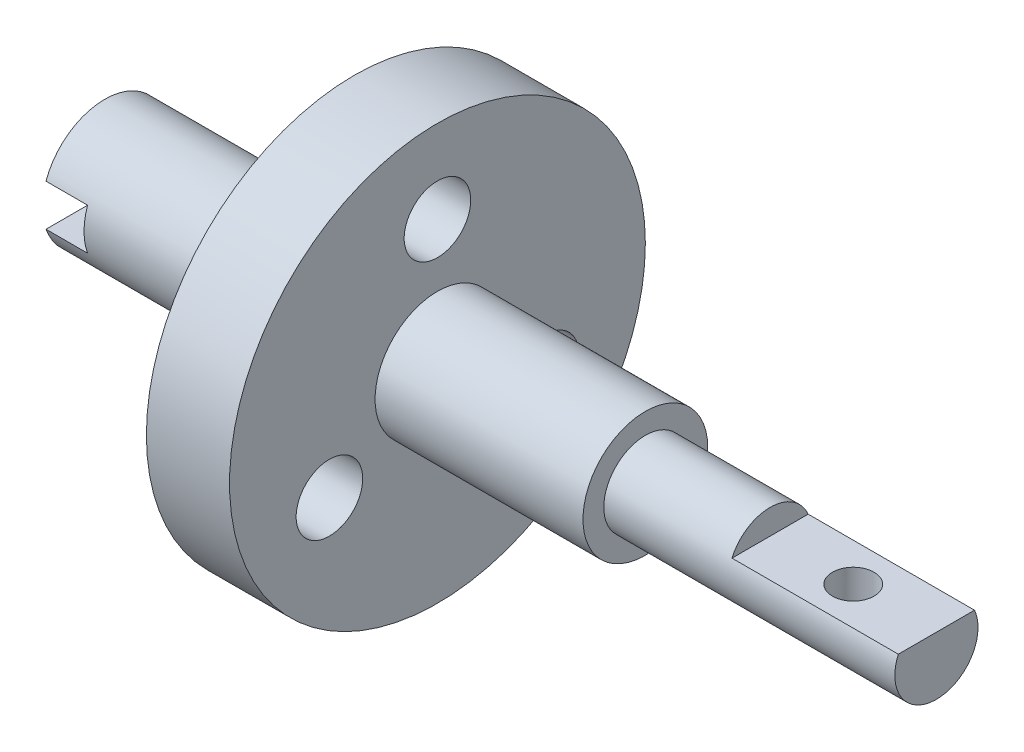
ISO-10303-21;
HEADER;
FILE_DESCRIPTION(('STEP AP214'),'2;1');
FILE_NAME('part.step','',(''),(''),'','','');
FILE_SCHEMA(('AUTOMOTIVE_DESIGN { 1 0 10303 214 1 1 1 1 }'));
ENDSEC;
DATA;
#1=APPLICATION_CONTEXT('core data for automotive mechanical design processes');
#2=APPLICATION_PROTOCOL_DEFINITION('international standard','automotive_design',2000,#1);
#3=PRODUCT_CONTEXT('',#1,'mechanical');
#4=PRODUCT('Part','Part','',(#3));
#5=PRODUCT_RELATED_PRODUCT_CATEGORY('part','',(#4));
#6=PRODUCT_DEFINITION_FORMATION('','',#4);
#7=PRODUCT_DEFINITION_CONTEXT('part definition',#1,'design');
#8=PRODUCT_DEFINITION('design','',#6,#7);
#9=PRODUCT_DEFINITION_SHAPE('','',#8);
#10=(LENGTH_UNIT() NAMED_UNIT(*) SI_UNIT(.MILLI.,.METRE.));
#11=(NAMED_UNIT(*) PLANE_ANGLE_UNIT() SI_UNIT($,.RADIAN.));
#12=(NAMED_UNIT(*) SI_UNIT($,.STERADIAN.) SOLID_ANGLE_UNIT());
#13=UNCERTAINTY_MEASURE_WITH_UNIT(LENGTH_MEASURE(1.E-05),#10,'distance_accuracy_value','');
#14=(GEOMETRIC_REPRESENTATION_CONTEXT(3) GLOBAL_UNCERTAINTY_ASSIGNED_CONTEXT((#13)) GLOBAL_UNIT_ASSIGNED_CONTEXT((#10,
#11,#12)) REPRESENTATION_CONTEXT('',''));
#15=CARTESIAN_POINT('',(0.,0.,0.));
#16=DIRECTION('',(0.,0.,1.));
#17=DIRECTION('',(1.,0.,0.));
#18=AXIS2_PLACEMENT_3D('',#15,#16,#17);
#19=CARTESIAN_POINT('',(-40.,0.,0.));
#20=DIRECTION('',(1.,0.,0.));
#21=DIRECTION('',(0.,0.,-1.));
#22=AXIS2_PLACEMENT_3D('',#19,#20,#21);
#23=PLANE('',#22);
#24=DIRECTION('',(0.,0.,1.));
#25=VECTOR('',#24,1.);
#26=CARTESIAN_POINT('',(-40.,2.5,0.));
#27=LINE('',#26,#25);
#28=CARTESIAN_POINT('',(-40.,2.5,-7.07106781186548));
#29=VERTEX_POINT('',#28);
#30=CARTESIAN_POINT('',(-40.,2.5,7.07106781186548));
#31=VERTEX_POINT('',#30);
#32=EDGE_CURVE('E390',#29,#31,#27,.T.);
#33=ORIENTED_EDGE('',*,*,#32,.T.);
#34=CARTESIAN_POINT('',(-40.,0.,0.));
#35=DIRECTION('',(-1.,0.,0.));
#36=DIRECTION('',(0.,0.,1.));
#37=AXIS2_PLACEMENT_3D('',#34,#35,#36);
#38=CIRCLE('',#37,7.5);
#39=EDGE_CURVE('E119',#31,#29,#38,.T.);
#40=ORIENTED_EDGE('',*,*,#39,.T.);
#41=EDGE_LOOP('',(#33,#40));
#42=FACE_BOUND('',#41,.T.);
#43=ADVANCED_FACE('F41',(#42),#23,.F.);
#44=CARTESIAN_POINT('',(0.,0.,0.));
#45=DIRECTION('',(1.,0.,0.));
#46=DIRECTION('',(0.,0.,-1.));
#47=AXIS2_PLACEMENT_3D('',#44,#45,#46);
#48=CYLINDRICAL_SURFACE('',#47,7.5);
#49=CARTESIAN_POINT('',(0.,0.,0.));
#50=DIRECTION('',(1.,0.,0.));
#51=DIRECTION('',(0.,0.,-1.));
#52=AXIS2_PLACEMENT_3D('',#49,#50,#51);
#53=CIRCLE('',#52,7.5);
#54=CARTESIAN_POINT('',(0.,0.,-7.5));
#55=VERTEX_POINT('',#54);
#56=EDGE_CURVE('E50',#55,#55,#53,.T.);
#57=ORIENTED_EDGE('',*,*,#56,.T.);
#58=EDGE_LOOP('',(#57));
#59=FACE_BOUND('',#58,.T.);
#60=CARTESIAN_POINT('',(25.,0.,0.));
#61=DIRECTION('',(1.,0.,0.));
#62=DIRECTION('',(0.,0.,-1.));
#63=AXIS2_PLACEMENT_3D('',#60,#61,#62);
#64=CIRCLE('',#63,7.5);
#65=CARTESIAN_POINT('',(25.,0.,-7.5));
#66=VERTEX_POINT('',#65);
#67=EDGE_CURVE('E199',#66,#66,#64,.F.);
#68=ORIENTED_EDGE('',*,*,#67,.T.);
#69=EDGE_LOOP('',(#68));
#70=FACE_BOUND('',#69,.T.);
#71=ADVANCED_FACE('F177',(#59,#70),#48,.T.);
#72=CARTESIAN_POINT('',(-40.,0.,0.));
#73=DIRECTION('',(1.,0.,0.));
#74=DIRECTION('',(0.,0.,-1.));
#75=AXIS2_PLACEMENT_3D('',#72,#73,#74);
#76=CYLINDRICAL_SURFACE('',#75,25.);
#77=CARTESIAN_POINT('',(0.,0.,0.));
#78=DIRECTION('',(1.,0.,0.));
#79=DIRECTION('',(0.,0.,-1.));
#80=AXIS2_PLACEMENT_3D('',#77,#78,#79);
#81=CIRCLE('',#80,25.);
#82=CARTESIAN_POINT('',(0.,0.,-25.));
#83=VERTEX_POINT('',#82);
#84=EDGE_CURVE('E12',#83,#83,#81,.F.);
#85=ORIENTED_EDGE('',*,*,#84,.T.);
#86=EDGE_LOOP('',(#85));
#87=FACE_BOUND('',#86,.T.);
#88=CARTESIAN_POINT('',(-10.,0.,0.));
#89=DIRECTION('',(-1.,0.,0.));
#90=DIRECTION('',(0.,0.,1.));
#91=AXIS2_PLACEMENT_3D('',#88,#89,#90);
#92=CIRCLE('',#91,25.);
#93=CARTESIAN_POINT('',(-10.,0.,25.));
#94=VERTEX_POINT('',#93);
#95=EDGE_CURVE('E209',#94,#94,#92,.F.);
#96=ORIENTED_EDGE('',*,*,#95,.T.);
#97=EDGE_LOOP('',(#96));
#98=FACE_BOUND('',#97,.T.);
#99=ADVANCED_FACE('F43',(#87,#98),#76,.T.);
#100=CARTESIAN_POINT('',(0.,0.,0.));
#101=DIRECTION('',(1.,0.,0.));
#102=DIRECTION('',(0.,0.,-1.));
#103=AXIS2_PLACEMENT_3D('',#100,#101,#102);
#104=PLANE('',#103);
#105=CARTESIAN_POINT('',(0.,15.,0.));
#106=DIRECTION('',(1.,0.,0.));
#107=DIRECTION('',(0.,0.,-1.));
#108=AXIS2_PLACEMENT_3D('',#105,#106,#107);
#109=CIRCLE('',#108,4.);
#110=CARTESIAN_POINT('',(0.,15.,-4.));
#111=VERTEX_POINT('',#110);
#112=EDGE_CURVE('E126',#111,#111,#109,.T.);
#113=ORIENTED_EDGE('',*,*,#112,.F.);
#114=EDGE_LOOP('',(#113));
#115=FACE_BOUND('',#114,.T.);
#116=CARTESIAN_POINT('',(0.,-7.50000000000006,-12.9903810567665));
#117=DIRECTION('',(1.,0.,0.));
#118=DIRECTION('',(0.,0.,-1.));
#119=AXIS2_PLACEMENT_3D('',#116,#117,#118);
#120=CIRCLE('',#119,4.);
#121=CARTESIAN_POINT('',(0.,-7.50000000000006,-16.9903810567665));
#122=VERTEX_POINT('',#121);
#123=EDGE_CURVE('E130',#122,#122,#120,.T.);
#124=ORIENTED_EDGE('',*,*,#123,.F.);
#125=EDGE_LOOP('',(#124));
#126=FACE_BOUND('',#125,.T.);
#127=CARTESIAN_POINT('',(0.,-7.49999999999988,12.9903810567667));
#128=DIRECTION('',(1.,0.,0.));
#129=DIRECTION('',(0.,0.,-1.));
#130=AXIS2_PLACEMENT_3D('',#127,#128,#129);
#131=CIRCLE('',#130,4.);
#132=CARTESIAN_POINT('',(0.,-7.49999999999988,8.99038105676665));
#133=VERTEX_POINT('',#132);
#134=EDGE_CURVE('E133',#133,#133,#131,.T.);
#135=ORIENTED_EDGE('',*,*,#134,.F.);
#136=EDGE_LOOP('',(#135));
#137=FACE_BOUND('',#136,.T.);
#138=ORIENTED_EDGE('',*,*,#84,.F.);
#139=EDGE_LOOP('',(#138));
#140=FACE_BOUND('',#139,.T.);
#141=ORIENTED_EDGE('',*,*,#56,.F.);
#142=EDGE_LOOP('',(#141));
#143=FACE_BOUND('',#142,.T.);
#144=ADVANCED_FACE('F226',(#115,#126,#137,#140,#143),#104,.T.);
#145=CARTESIAN_POINT('',(-10.,0.,0.));
#146=DIRECTION('',(-1.,0.,0.));
#147=DIRECTION('',(0.,0.,1.));
#148=AXIS2_PLACEMENT_3D('',#145,#146,#147);
#149=PLANE('',#148);
#150=CARTESIAN_POINT('',(-10.,15.,0.));
#151=DIRECTION('',(-1.,0.,0.));
#152=DIRECTION('',(0.,0.,1.));
#153=AXIS2_PLACEMENT_3D('',#150,#151,#152);
#154=CIRCLE('',#153,4.);
#155=CARTESIAN_POINT('',(-10.,15.,4.));
#156=VERTEX_POINT('',#155);
#157=EDGE_CURVE('E45',#156,#156,#154,.T.);
#158=ORIENTED_EDGE('',*,*,#157,.F.);
#159=EDGE_LOOP('',(#158));
#160=FACE_BOUND('',#159,.T.);
#161=CARTESIAN_POINT('',(-10.,-7.50000000000006,-12.9903810567665));
#162=DIRECTION('',(-1.,0.,0.));
#163=DIRECTION('',(0.,0.,1.));
#164=AXIS2_PLACEMENT_3D('',#161,#162,#163);
#165=CIRCLE('',#164,4.);
#166=CARTESIAN_POINT('',(-10.,-7.50000000000006,-8.99038105676655));
#167=VERTEX_POINT('',#166);
#168=EDGE_CURVE('E214',#167,#167,#165,.T.);
#169=ORIENTED_EDGE('',*,*,#168,.F.);
#170=EDGE_LOOP('',(#169));
#171=FACE_BOUND('',#170,.T.);
#172=CARTESIAN_POINT('',(-10.,-7.49999999999988,12.9903810567667));
#173=DIRECTION('',(-1.,0.,0.));
#174=DIRECTION('',(0.,0.,1.));
#175=AXIS2_PLACEMENT_3D('',#172,#173,#174);
#176=CIRCLE('',#175,4.);
#177=CARTESIAN_POINT('',(-10.,-7.49999999999988,16.9903810567667));
#178=VERTEX_POINT('',#177);
#179=EDGE_CURVE('E129',#178,#178,#176,.T.);
#180=ORIENTED_EDGE('',*,*,#179,.F.);
#181=EDGE_LOOP('',(#180));
#182=FACE_BOUND('',#181,.T.);
#183=ORIENTED_EDGE('',*,*,#95,.F.);
#184=EDGE_LOOP('',(#183));
#185=FACE_BOUND('',#184,.T.);
#186=CARTESIAN_POINT('',(-10.,0.,0.));
#187=DIRECTION('',(-1.,0.,0.));
#188=DIRECTION('',(0.,0.,1.));
#189=AXIS2_PLACEMENT_3D('',#186,#187,#188);
#190=CIRCLE('',#189,7.5);
#191=CARTESIAN_POINT('',(-10.,0.,7.5));
#192=VERTEX_POINT('',#191);
#193=EDGE_CURVE('E201',#192,#192,#190,.T.);
#194=ORIENTED_EDGE('',*,*,#193,.F.);
#195=EDGE_LOOP('',(#194));
#196=FACE_BOUND('',#195,.T.);
#197=ADVANCED_FACE('F193',(#160,#171,#182,#185,#196),#149,.T.);
#198=CARTESIAN_POINT('',(-10.,0.,0.));
#199=DIRECTION('',(-1.,0.,0.));
#200=DIRECTION('',(0.,0.,1.));
#201=AXIS2_PLACEMENT_3D('',#198,#199,#200);
#202=CYLINDRICAL_SURFACE('',#201,7.5);
#203=DIRECTION('',(-1.,0.,0.));
#204=VECTOR('',#203,1.);
#205=CARTESIAN_POINT('',(-35.,-2.5,-7.07106781186548));
#206=LINE('',#205,#204);
#207=CARTESIAN_POINT('',(-35.,-2.5,-7.07106781186548));
#208=VERTEX_POINT('',#207);
#209=CARTESIAN_POINT('',(-40.,-2.5,-7.07106781186548));
#210=VERTEX_POINT('',#209);
#211=EDGE_CURVE('E121',#208,#210,#206,.T.);
#212=ORIENTED_EDGE('',*,*,#211,.F.);
#213=CARTESIAN_POINT('',(-35.,0.,0.));
#214=DIRECTION('',(-1.,0.,0.));
#215=DIRECTION('',(0.,0.,1.));
#216=AXIS2_PLACEMENT_3D('',#213,#214,#215);
#217=CIRCLE('',#216,7.5);
#218=CARTESIAN_POINT('',(-35.,2.5,-7.07106781186548));
#219=VERTEX_POINT('',#218);
#220=EDGE_CURVE('E102',#219,#208,#217,.T.);
#221=ORIENTED_EDGE('',*,*,#220,.F.);
#222=DIRECTION('',(-1.,0.,0.));
#223=VECTOR('',#222,1.);
#224=CARTESIAN_POINT('',(-35.,2.5,-7.07106781186548));
#225=LINE('',#224,#223);
#226=EDGE_CURVE('E99',#219,#29,#225,.T.);
#227=ORIENTED_EDGE('',*,*,#226,.T.);
#228=ORIENTED_EDGE('',*,*,#39,.F.);
#229=DIRECTION('',(-1.,0.,0.));
#230=VECTOR('',#229,1.);
#231=CARTESIAN_POINT('',(-35.,2.5,7.07106781186548));
#232=LINE('',#231,#230);
#233=CARTESIAN_POINT('',(-35.,2.5,7.07106781186548));
#234=VERTEX_POINT('',#233);
#235=EDGE_CURVE('E58',#234,#31,#232,.T.);
#236=ORIENTED_EDGE('',*,*,#235,.F.);
#237=CARTESIAN_POINT('',(-35.,-2.5,7.07106781186548));
#238=VERTEX_POINT('',#237);
#239=EDGE_CURVE('E103',#238,#234,#217,.T.);
#240=ORIENTED_EDGE('',*,*,#239,.F.);
#241=DIRECTION('',(-1.,0.,0.));
#242=VECTOR('',#241,1.);
#243=CARTESIAN_POINT('',(-35.,-2.5,7.07106781186548));
#244=LINE('',#243,#242);
#245=CARTESIAN_POINT('',(-40.,-2.5,7.07106781186548));
#246=VERTEX_POINT('',#245);
#247=EDGE_CURVE('E136',#238,#246,#244,.T.);
#248=ORIENTED_EDGE('',*,*,#247,.T.);
#249=EDGE_CURVE('E198',#210,#246,#38,.T.);
#250=ORIENTED_EDGE('',*,*,#249,.F.);
#251=EDGE_LOOP('',(#212,#221,#227,#228,#236,#240,#248,#250));
#252=FACE_BOUND('',#251,.T.);
#253=ORIENTED_EDGE('',*,*,#193,.T.);
#254=EDGE_LOOP('',(#253));
#255=FACE_BOUND('',#254,.T.);
#256=ADVANCED_FACE('F116',(#252,#255),#202,.T.);
#257=ORIENTED_EDGE('',*,*,#249,.T.);
#258=DIRECTION('',(0.,0.,1.));
#259=VECTOR('',#258,1.);
#260=CARTESIAN_POINT('',(-40.,-2.5,0.));
#261=LINE('',#260,#259);
#262=EDGE_CURVE('E112',#210,#246,#261,.T.);
#263=ORIENTED_EDGE('',*,*,#262,.F.);
#264=EDGE_LOOP('',(#257,#263));
#265=FACE_BOUND('',#264,.T.);
#266=ADVANCED_FACE('F179',(#265),#23,.F.);
#267=CARTESIAN_POINT('',(25.,0.,0.));
#268=DIRECTION('',(1.,0.,0.));
#269=DIRECTION('',(0.,0.,-1.));
#270=AXIS2_PLACEMENT_3D('',#267,#268,#269);
#271=PLANE('',#270);
#272=ORIENTED_EDGE('',*,*,#67,.F.);
#273=EDGE_LOOP('',(#272));
#274=FACE_BOUND('',#273,.T.);
#275=CARTESIAN_POINT('',(25.,0.,0.));
#276=DIRECTION('',(1.,0.,0.));
#277=DIRECTION('',(0.,0.,-1.));
#278=AXIS2_PLACEMENT_3D('',#275,#276,#277);
#279=CIRCLE('',#278,5.);
#280=CARTESIAN_POINT('',(25.,0.,-5.));
#281=VERTEX_POINT('',#280);
#282=EDGE_CURVE('E203',#281,#281,#279,.T.);
#283=ORIENTED_EDGE('',*,*,#282,.F.);
#284=EDGE_LOOP('',(#283));
#285=FACE_BOUND('',#284,.T.);
#286=ADVANCED_FACE('F186',(#274,#285),#271,.T.);
#287=CARTESIAN_POINT('',(25.,0.,0.));
#288=DIRECTION('',(1.,0.,0.));
#289=DIRECTION('',(0.,0.,-1.));
#290=AXIS2_PLACEMENT_3D('',#287,#288,#289);
#291=CYLINDRICAL_SURFACE('',#290,5.);
#292=CARTESIAN_POINT('',(50.,-4.33012701892219,2.5));
#293=CARTESIAN_POINT('',(49.8697334931235,-4.33013982272991,2.49998948436432));
#294=CARTESIAN_POINT('',(49.7392972793237,-4.33609541965583,2.48974954513168));
#295=CARTESIAN_POINT('',(49.4824310284708,-4.35905877051907,2.44930840724944));
#296=CARTESIAN_POINT('',(49.3560099959427,-4.37608974726023,2.41906526369545));
#297=CARTESIAN_POINT('',(49.1113710544389,-4.41873376871659,2.3402497699757));
#298=CARTESIAN_POINT('',(48.9931134264378,-4.44430111338921,2.29177485369963));
#299=CARTESIAN_POINT('',(48.7664394369055,-4.50106659111455,2.17816884056414));
#300=CARTESIAN_POINT('',(48.6580236082042,-4.53226502875883,2.11303684262671));
#301=CARTESIAN_POINT('',(48.4442356960831,-4.59992173524851,1.96166634317253));
#302=CARTESIAN_POINT('',(48.3398521655102,-4.63660159331577,1.87413008816917));
#303=CARTESIAN_POINT('',(48.1464790242868,-4.70929956727453,1.68313452122752));
#304=CARTESIAN_POINT('',(48.057497092245,-4.74531734512768,1.57966731506051));
#305=CARTESIAN_POINT('',(47.8915821235144,-4.81553692452135,1.35122390789081));
#306=CARTESIAN_POINT('',(47.8158655807208,-4.84945266064072,1.22526797235894));
#307=CARTESIAN_POINT('',(47.6871478665161,-4.90876890230193,0.960392566671143));
#308=CARTESIAN_POINT('',(47.6341323595615,-4.93417477954535,0.82148134538998));
#309=CARTESIAN_POINT('',(47.556238346836,-4.9720115311507,0.545112359773521));
#310=CARTESIAN_POINT('',(47.5296261841349,-4.98523700553425,0.408254476210981));
#311=CARTESIAN_POINT('',(47.4995847032887,-5.00018959613973,0.131426571755675));
#312=CARTESIAN_POINT('',(47.4961413580046,-5.00192366961168,-0.00854151460651022));
#313=CARTESIAN_POINT('',(47.5118666849314,-4.99407454791405,-0.274581311061966));
#314=CARTESIAN_POINT('',(47.5290950388045,-4.98546239730476,-0.400802997942675));
#315=CARTESIAN_POINT('',(47.5822021097601,-4.95935613149294,-0.648284429795112));
#316=CARTESIAN_POINT('',(47.6180822224402,-4.94186135165964,-0.769543802734627));
#317=CARTESIAN_POINT('',(47.7077064152249,-4.89928958219156,-1.00577347892408));
#318=CARTESIAN_POINT('',(47.7616907829303,-4.87411103823003,-1.120633558788));
#319=CARTESIAN_POINT('',(47.8856585405036,-4.81844114966712,-1.33994200378327));
#320=CARTESIAN_POINT('',(47.9556476582558,-4.78794790393709,-1.4443866220966));
#321=CARTESIAN_POINT('',(48.1172383788326,-4.72110985998075,-1.6504341522455));
#322=CARTESIAN_POINT('',(48.210257570815,-4.68448439995438,-1.7508351875734));
#323=CARTESIAN_POINT('',(48.4114743123254,-4.61135851467029,-1.93526092574444));
#324=CARTESIAN_POINT('',(48.5196834306851,-4.57485820664072,-2.01927302893558));
#325=CARTESIAN_POINT('',(48.7566204810602,-4.50360390231212,-2.17376333660553));
#326=CARTESIAN_POINT('',(48.8862150576355,-4.46910799976769,-2.24304328744513));
#327=CARTESIAN_POINT('',(49.1573441783975,-4.4093862569644,-2.35829778250308));
#328=CARTESIAN_POINT('',(49.2988660825439,-4.38415075115168,-2.40429664552722));
#329=CARTESIAN_POINT('',(49.578036278207,-4.34861589542586,-2.4679505275626));
#330=CARTESIAN_POINT('',(49.7151027976089,-4.33729139621241,-2.48756280529994));
#331=CARTESIAN_POINT('',(49.9910033537913,-4.32794798404024,-2.50379236652857));
#332=CARTESIAN_POINT('',(50.1298360727995,-4.32991967223279,-2.50042589328757));
#333=CARTESIAN_POINT('',(50.3891347964468,-4.34585841351462,-2.47259010835991));
#334=CARTESIAN_POINT('',(50.5099486277697,-4.35848968766635,-2.45046954178116));
#335=CARTESIAN_POINT('',(50.7459194656775,-4.39235053878353,-2.38924071158112));
#336=CARTESIAN_POINT('',(50.8610746268668,-4.41358290012585,-2.35012694655908));
#337=CARTESIAN_POINT('',(51.0885283272564,-4.46340555199141,-2.25411897151217));
#338=CARTESIAN_POINT('',(51.2004475421326,-4.49229108107657,-2.19648515923163));
#339=CARTESIAN_POINT('',(51.4136731788488,-4.55390298743125,-2.0657176600397));
#340=CARTESIAN_POINT('',(51.5149741087881,-4.58663133387872,-1.99257601083123));
#341=CARTESIAN_POINT('',(51.7174469188033,-4.65719996140836,-1.82209291799635));
#342=CARTESIAN_POINT('',(51.8169928767722,-4.69516457885708,-1.72286318078434));
#343=CARTESIAN_POINT('',(51.9985305950059,-4.76835587444746,-1.50851123849879));
#344=CARTESIAN_POINT('',(52.0805164256586,-4.80358162519329,-1.39338368664988));
#345=CARTESIAN_POINT('',(52.2264343147909,-4.86853404227334,-1.14633840638507));
#346=CARTESIAN_POINT('',(52.2898327952085,-4.89809104179855,-1.01405774389062));
#347=CARTESIAN_POINT('',(52.392844759962,-4.9470838739847,-0.738805911647331));
#348=CARTESIAN_POINT('',(52.4324791296051,-4.96652859191746,-0.595844253647065));
#349=CARTESIAN_POINT('',(52.4834214093564,-4.99168770453968,-0.317449205674703));
#350=CARTESIAN_POINT('',(52.4969946858303,-4.99849819767838,-0.182528609085373));
#351=CARTESIAN_POINT('',(52.5021081674946,-5.00105325940467,0.0878149643374356));
#352=CARTESIAN_POINT('',(52.4936560856611,-4.99680170177041,0.223237748727021));
#353=CARTESIAN_POINT('',(52.4564589696045,-4.97834922085637,0.481344982671078));
#354=CARTESIAN_POINT('',(52.4290878283637,-4.96482236636807,0.604280801321777));
#355=CARTESIAN_POINT('',(52.3566825502417,-4.92980234191731,0.843614873664458));
#356=CARTESIAN_POINT('',(52.3116458803664,-4.90830802955518,0.960012187087216));
#357=CARTESIAN_POINT('',(52.2031821812607,-4.85814826741488,1.18855854199593));
#358=CARTESIAN_POINT('',(52.1390509753102,-4.82921542506803,1.30031295715363));
#359=CARTESIAN_POINT('',(51.9951058898524,-4.76720333344986,1.51193650408535));
#360=CARTESIAN_POINT('',(51.9152848073731,-4.73412218229104,1.61180014305398));
#361=CARTESIAN_POINT('',(51.7330042055506,-4.66321523550925,1.8072854232437));
#362=CARTESIAN_POINT('',(51.6290822739993,-4.62524489658366,1.90149582349002));
#363=CARTESIAN_POINT('',(51.4063847146178,-4.55157698284941,2.07165660492503));
#364=CARTESIAN_POINT('',(51.2875960858008,-4.51588143910584,2.1475908315154));
#365=CARTESIAN_POINT('',(51.0333638823357,-4.44998982823926,2.28108393396029));
#366=CARTESIAN_POINT('',(50.8975126115754,-4.42000320346984,2.3379862797745));
#367=CARTESIAN_POINT('',(50.6867773504802,-4.38370272660093,2.40494911880459));
#368=CARTESIAN_POINT('',(50.6154402243024,-4.37305486646054,2.42419582683991));
#369=CARTESIAN_POINT('',(50.4709593031507,-4.35507574170935,2.45635087255789));
#370=CARTESIAN_POINT('',(50.3978168090456,-4.34774215854234,2.46926364179177));
#371=CARTESIAN_POINT('',(50.2704990134531,-4.3382377954292,2.48591166201424));
#372=CARTESIAN_POINT('',(50.2165836784878,-4.33520487024791,2.49118864979203));
#373=CARTESIAN_POINT('',(50.1084553836896,-4.33114674911322,2.49823512543934));
#374=CARTESIAN_POINT('',(50.0542424041894,-4.33012168747261,2.50000437866475));
#375=CARTESIAN_POINT('',(50.,-4.33012701892219,2.5));
#376=B_SPLINE_CURVE_WITH_KNOTS('',3,(#292,#293,#294,#295,#296,#297,#298,#299,#300,#301,#302,
#303,#304,#305,#306,#307,#308,#309,#310,#311,#312,#313,#314,#315,#316,#317,#318,#319,#320,#321,
#322,#323,#324,#325,#326,#327,#328,#329,#330,#331,#332,#333,#334,#335,#336,#337,#338,#339,#340,
#341,#342,#343,#344,#345,#346,#347,#348,#349,#350,#351,#352,#353,#354,#355,#356,#357,#358,#359,
#360,#361,#362,#363,#364,#365,#366,#367,#368,#369,#370,#371,#372,#373,#374,#375),.UNSPECIFIED.,
.T.,.F.,(4,2,2,2,2,2,2,2,2,2,2,2,2,2,2,2,2,2,2,2,2,2,2,2,2,2,2,2,2,2,2,2,2,2,2,2,2,2,2,2,2,4),
(0.,0.390580306486788,0.781982232062015,1.17132148982692,1.56068181366371,1.98215578129642,
2.40383927716012,2.85394730601993,3.30377067414811,3.72158712424922,4.13915059220184,
4.5204024371643,4.90168281298722,5.28823836832951,5.67493248380764,6.09817978647309,
6.5217512061988,6.97222104328704,7.42221935534346,7.83655727140613,8.25060232976016,
8.61935458565147,8.98822631095241,9.37418241020303,9.76033715555202,10.1951685895662,
10.6301466245059,11.076604535375,11.5226694952701,11.927806759788,12.3328021699001,
12.7111106218382,13.0894733378512,13.4840187680376,13.8787457525688,14.3127560463025,
14.7471485711797,15.195268726016,15.4189244153949,15.6424233996907,15.8050484542806,
15.9676843870379),.UNSPECIFIED.);
#377=CARTESIAN_POINT('',(50.,-4.33012701892219,2.5));
#378=VERTEX_POINT('',#377);
#379=EDGE_CURVE('E140',#378,#378,#376,.T.);
#380=ORIENTED_EDGE('',*,*,#379,.F.);
#381=EDGE_LOOP('',(#380));
#382=FACE_BOUND('',#381,.T.);
#383=DIRECTION('',(1.,0.,0.));
#384=VECTOR('',#383,1.);
#385=CARTESIAN_POINT('',(40.,2.,-4.58257569495584));
#386=LINE('',#385,#384);
#387=CARTESIAN_POINT('',(40.,2.,-4.58257569495584));
#388=VERTEX_POINT('',#387);
#389=CARTESIAN_POINT('',(60.,2.,-4.58257569495584));
#390=VERTEX_POINT('',#389);
#391=EDGE_CURVE('E256',#388,#390,#386,.T.);
#392=ORIENTED_EDGE('',*,*,#391,.T.);
#393=CARTESIAN_POINT('',(60.,0.,0.));
#394=DIRECTION('',(1.,0.,0.));
#395=DIRECTION('',(0.,0.,-1.));
#396=AXIS2_PLACEMENT_3D('',#393,#394,#395);
#397=CIRCLE('',#396,5.);
#398=CARTESIAN_POINT('',(60.,2.,4.58257569495584));
#399=VERTEX_POINT('',#398);
#400=EDGE_CURVE('E253',#399,#390,#397,.T.);
#401=ORIENTED_EDGE('',*,*,#400,.F.);
#402=DIRECTION('',(1.,0.,0.));
#403=VECTOR('',#402,1.);
#404=CARTESIAN_POINT('',(40.,2.,4.58257569495584));
#405=LINE('',#404,#403);
#406=CARTESIAN_POINT('',(40.,2.,4.58257569495584));
#407=VERTEX_POINT('',#406);
#408=EDGE_CURVE('E66',#407,#399,#405,.T.);
#409=ORIENTED_EDGE('',*,*,#408,.F.);
#410=CARTESIAN_POINT('',(40.,0.,0.));
#411=DIRECTION('',(1.,0.,0.));
#412=DIRECTION('',(0.,0.,-1.));
#413=AXIS2_PLACEMENT_3D('',#410,#411,#412);
#414=CIRCLE('',#413,5.);
#415=EDGE_CURVE('E149',#388,#407,#414,.T.);
#416=ORIENTED_EDGE('',*,*,#415,.F.);
#417=EDGE_LOOP('',(#392,#401,#409,#416));
#418=FACE_BOUND('',#417,.T.);
#419=ORIENTED_EDGE('',*,*,#282,.T.);
#420=EDGE_LOOP('',(#419));
#421=FACE_BOUND('',#420,.T.);
#422=ADVANCED_FACE('F151',(#382,#418,#421),#291,.T.);
#423=CARTESIAN_POINT('',(60.,0.,0.));
#424=DIRECTION('',(1.,0.,0.));
#425=DIRECTION('',(0.,0.,-1.));
#426=AXIS2_PLACEMENT_3D('',#423,#424,#425);
#427=PLANE('',#426);
#428=DIRECTION('',(0.,0.,-1.));
#429=VECTOR('',#428,1.);
#430=CARTESIAN_POINT('',(60.,2.,0.));
#431=LINE('',#430,#429);
#432=EDGE_CURVE('E148',#399,#390,#431,.T.);
#433=ORIENTED_EDGE('',*,*,#432,.F.);
#434=ORIENTED_EDGE('',*,*,#400,.T.);
#435=EDGE_LOOP('',(#433,#434));
#436=FACE_BOUND('',#435,.T.);
#437=ADVANCED_FACE('F168',(#436),#427,.T.);
#438=CARTESIAN_POINT('',(40.,2.,0.));
#439=DIRECTION('',(0.,-1.,0.));
#440=DIRECTION('',(0.,0.,-1.));
#441=AXIS2_PLACEMENT_3D('',#438,#439,#440);
#442=PLANE('',#441);
#443=CARTESIAN_POINT('',(50.,2.,0.));
#444=DIRECTION('',(0.,1.,0.));
#445=DIRECTION('',(0.,0.,1.));
#446=AXIS2_PLACEMENT_3D('',#443,#444,#445);
#447=CIRCLE('',#446,2.5);
#448=CARTESIAN_POINT('',(50.,2.,2.5));
#449=VERTEX_POINT('',#448);
#450=EDGE_CURVE('E137',#449,#449,#447,.T.);
#451=ORIENTED_EDGE('',*,*,#450,.F.);
#452=EDGE_LOOP('',(#451));
#453=FACE_BOUND('',#452,.T.);
#454=ORIENTED_EDGE('',*,*,#432,.T.);
#455=ORIENTED_EDGE('',*,*,#391,.F.);
#456=DIRECTION('',(0.,0.,-1.));
#457=VECTOR('',#456,1.);
#458=CARTESIAN_POINT('',(40.,2.,0.));
#459=LINE('',#458,#457);
#460=EDGE_CURVE('E259',#407,#388,#459,.T.);
#461=ORIENTED_EDGE('',*,*,#460,.F.);
#462=ORIENTED_EDGE('',*,*,#408,.T.);
#463=EDGE_LOOP('',(#454,#455,#461,#462));
#464=FACE_BOUND('',#463,.T.);
#465=ADVANCED_FACE('F165',(#453,#464),#442,.F.);
#466=CARTESIAN_POINT('',(40.,0.,0.));
#467=DIRECTION('',(1.,0.,0.));
#468=DIRECTION('',(0.,0.,-1.));
#469=AXIS2_PLACEMENT_3D('',#466,#467,#468);
#470=PLANE('',#469);
#471=ORIENTED_EDGE('',*,*,#415,.T.);
#472=ORIENTED_EDGE('',*,*,#460,.T.);
#473=EDGE_LOOP('',(#471,#472));
#474=FACE_BOUND('',#473,.T.);
#475=ADVANCED_FACE('F161',(#474),#470,.T.);
#476=CARTESIAN_POINT('',(50.,-25.,0.));
#477=DIRECTION('',(0.,1.,0.));
#478=DIRECTION('',(0.,0.,1.));
#479=AXIS2_PLACEMENT_3D('',#476,#477,#478);
#480=CYLINDRICAL_SURFACE('',#479,2.5);
#481=ORIENTED_EDGE('',*,*,#379,.T.);
#482=EDGE_LOOP('',(#481));
#483=FACE_BOUND('',#482,.T.);
#484=ORIENTED_EDGE('',*,*,#450,.T.);
#485=EDGE_LOOP('',(#484));
#486=FACE_BOUND('',#485,.T.);
#487=ADVANCED_FACE('F155',(#483,#486),#480,.F.);
#488=CARTESIAN_POINT('',(-20.,-7.49999999999988,12.9903810567667));
#489=DIRECTION('',(1.,0.,0.));
#490=DIRECTION('',(0.,0.,-1.));
#491=AXIS2_PLACEMENT_3D('',#488,#489,#490);
#492=CYLINDRICAL_SURFACE('',#491,4.);
#493=ORIENTED_EDGE('',*,*,#179,.T.);
#494=EDGE_LOOP('',(#493));
#495=FACE_BOUND('',#494,.T.);
#496=ORIENTED_EDGE('',*,*,#134,.T.);
#497=EDGE_LOOP('',(#496));
#498=FACE_BOUND('',#497,.T.);
#499=ADVANCED_FACE('F160',(#495,#498),#492,.F.);
#500=CARTESIAN_POINT('',(-20.,-7.50000000000006,-12.9903810567665));
#501=DIRECTION('',(1.,0.,0.));
#502=DIRECTION('',(0.,0.,-1.));
#503=AXIS2_PLACEMENT_3D('',#500,#501,#502);
#504=CYLINDRICAL_SURFACE('',#503,4.);
#505=ORIENTED_EDGE('',*,*,#168,.T.);
#506=EDGE_LOOP('',(#505));
#507=FACE_BOUND('',#506,.T.);
#508=ORIENTED_EDGE('',*,*,#123,.T.);
#509=EDGE_LOOP('',(#508));
#510=FACE_BOUND('',#509,.T.);
#511=ADVANCED_FACE('F303',(#507,#510),#504,.F.);
#512=CARTESIAN_POINT('',(-20.,15.,0.));
#513=DIRECTION('',(1.,0.,0.));
#514=DIRECTION('',(0.,0.,-1.));
#515=AXIS2_PLACEMENT_3D('',#512,#513,#514);
#516=CYLINDRICAL_SURFACE('',#515,4.);
#517=ORIENTED_EDGE('',*,*,#157,.T.);
#518=EDGE_LOOP('',(#517));
#519=FACE_BOUND('',#518,.T.);
#520=ORIENTED_EDGE('',*,*,#112,.T.);
#521=EDGE_LOOP('',(#520));
#522=FACE_BOUND('',#521,.T.);
#523=ADVANCED_FACE('F221',(#519,#522),#516,.F.);
#524=CARTESIAN_POINT('',(-35.,-2.5,0.));
#525=DIRECTION('',(0.,-1.,0.));
#526=DIRECTION('',(0.,0.,-1.));
#527=AXIS2_PLACEMENT_3D('',#524,#525,#526);
#528=PLANE('',#527);
#529=ORIENTED_EDGE('',*,*,#262,.T.);
#530=ORIENTED_EDGE('',*,*,#247,.F.);
#531=DIRECTION('',(0.,0.,1.));
#532=VECTOR('',#531,1.);
#533=CARTESIAN_POINT('',(-35.,-2.5,0.));
#534=LINE('',#533,#532);
#535=EDGE_CURVE('E109',#208,#238,#534,.T.);
#536=ORIENTED_EDGE('',*,*,#535,.F.);
#537=ORIENTED_EDGE('',*,*,#211,.T.);
#538=EDGE_LOOP('',(#529,#530,#536,#537));
#539=FACE_BOUND('',#538,.T.);
#540=ADVANCED_FACE('F316',(#539),#528,.F.);
#541=CARTESIAN_POINT('',(-35.,2.5,0.));
#542=DIRECTION('',(0.,-1.,0.));
#543=DIRECTION('',(0.,0.,-1.));
#544=AXIS2_PLACEMENT_3D('',#541,#542,#543);
#545=PLANE('',#544);
#546=ORIENTED_EDGE('',*,*,#32,.F.);
#547=ORIENTED_EDGE('',*,*,#226,.F.);
#548=DIRECTION('',(0.,0.,1.));
#549=VECTOR('',#548,1.);
#550=CARTESIAN_POINT('',(-35.,2.5,0.));
#551=LINE('',#550,#549);
#552=EDGE_CURVE('E95',#219,#234,#551,.T.);
#553=ORIENTED_EDGE('',*,*,#552,.T.);
#554=ORIENTED_EDGE('',*,*,#235,.T.);
#555=EDGE_LOOP('',(#546,#547,#553,#554));
#556=FACE_BOUND('',#555,.T.);
#557=ADVANCED_FACE('F97',(#556),#545,.T.);
#558=CARTESIAN_POINT('',(-35.,0.,0.));
#559=DIRECTION('',(-1.,0.,0.));
#560=DIRECTION('',(0.,0.,1.));
#561=AXIS2_PLACEMENT_3D('',#558,#559,#560);
#562=PLANE('',#561);
#563=ORIENTED_EDGE('',*,*,#239,.T.);
#564=ORIENTED_EDGE('',*,*,#552,.F.);
#565=ORIENTED_EDGE('',*,*,#220,.T.);
#566=ORIENTED_EDGE('',*,*,#535,.T.);
#567=EDGE_LOOP('',(#563,#564,#565,#566));
#568=FACE_BOUND('',#567,.T.);
#569=ADVANCED_FACE('F107',(#568),#562,.T.);
#570=CLOSED_SHELL('',(#43,#71,#99,#144,#197,#256,#266,#286,#422,#437,#465,#475,#487,#499,#511,
#523,#540,#557,#569));
#571=MANIFOLD_SOLID_BREP('B2',#570);
#572=ADVANCED_BREP_SHAPE_REPRESENTATION('',(#18,#571),#14);
#573=SHAPE_DEFINITION_REPRESENTATION(#9,#572);
ENDSEC;
END-ISO-10303-21;
